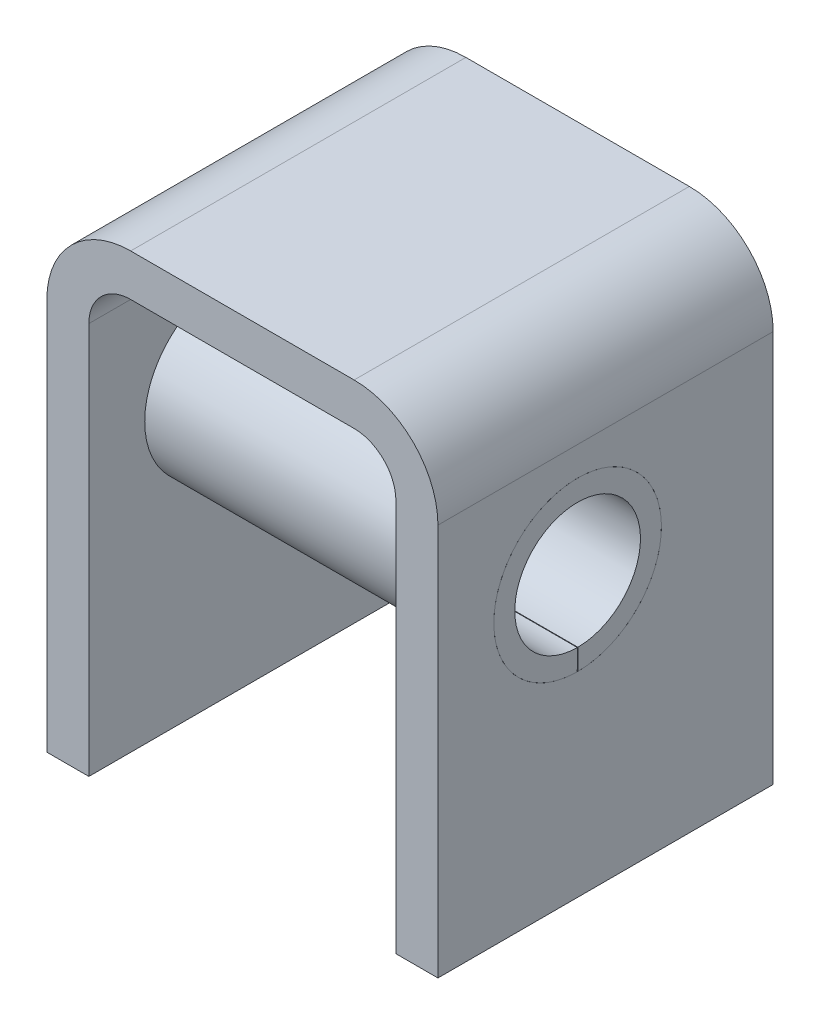
ISO-10303-21;
HEADER;
FILE_DESCRIPTION(('STEP AP214'),'2;1');
FILE_NAME('part.step','',(''),(''),'','','');
FILE_SCHEMA(('AUTOMOTIVE_DESIGN { 1 0 10303 214 1 1 1 1 }'));
ENDSEC;
DATA;
#1=APPLICATION_CONTEXT('core data for automotive mechanical design processes');
#2=APPLICATION_PROTOCOL_DEFINITION('international standard','automotive_design',2000,#1);
#3=PRODUCT_CONTEXT('',#1,'mechanical');
#4=PRODUCT('Part','Part','',(#3));
#5=PRODUCT_RELATED_PRODUCT_CATEGORY('part','',(#4));
#6=PRODUCT_DEFINITION_FORMATION('','',#4);
#7=PRODUCT_DEFINITION_CONTEXT('part definition',#1,'design');
#8=PRODUCT_DEFINITION('design','',#6,#7);
#9=PRODUCT_DEFINITION_SHAPE('','',#8);
#10=(LENGTH_UNIT() NAMED_UNIT(*) SI_UNIT(.MILLI.,.METRE.));
#11=(NAMED_UNIT(*) PLANE_ANGLE_UNIT() SI_UNIT($,.RADIAN.));
#12=(NAMED_UNIT(*) SI_UNIT($,.STERADIAN.) SOLID_ANGLE_UNIT());
#13=UNCERTAINTY_MEASURE_WITH_UNIT(LENGTH_MEASURE(1.E-05),#10,'distance_accuracy_value','');
#14=(GEOMETRIC_REPRESENTATION_CONTEXT(3) GLOBAL_UNCERTAINTY_ASSIGNED_CONTEXT((#13)) GLOBAL_UNIT_ASSIGNED_CONTEXT((#10,
#11,#12)) REPRESENTATION_CONTEXT('',''));
#15=CARTESIAN_POINT('',(0.,0.,0.));
#16=DIRECTION('',(0.,0.,1.));
#17=DIRECTION('',(1.,0.,0.));
#18=AXIS2_PLACEMENT_3D('',#15,#16,#17);
#19=CARTESIAN_POINT('',(22.225,-22.352,3.175));
#20=DIRECTION('',(-1.,0.,0.));
#21=DIRECTION('',(0.,0.,1.));
#22=AXIS2_PLACEMENT_3D('',#19,#20,#21);
#23=CYLINDRICAL_SURFACE('',#22,7.14375);
#24=CARTESIAN_POINT('',(-22.225,-22.352,3.175));
#25=DIRECTION('',(-1.,0.,0.));
#26=DIRECTION('',(0.,0.,-1.));
#27=AXIS2_PLACEMENT_3D('',#24,#25,#26);
#28=CIRCLE('',#27,7.14375);
#29=CARTESIAN_POINT('',(-22.225,-29.4956819966488,3.20617039070291));
#30=VERTEX_POINT('',#29);
#31=CARTESIAN_POINT('',(-22.225,-29.4956819966488,3.14382960929709));
#32=VERTEX_POINT('',#31);
#33=EDGE_CURVE('E107',#30,#32,#28,.T.);
#34=ORIENTED_EDGE('',*,*,#33,.T.);
#35=DIRECTION('',(-1.,0.,0.));
#36=VECTOR('',#35,1.);
#37=CARTESIAN_POINT('',(22.225,-29.4956819966488,3.14382960929709));
#38=LINE('',#37,#36);
#39=CARTESIAN_POINT('',(22.225,-29.4956819966488,3.14382960929709));
#40=VERTEX_POINT('',#39);
#41=EDGE_CURVE('E12',#40,#32,#38,.T.);
#42=ORIENTED_EDGE('',*,*,#41,.F.);
#43=CARTESIAN_POINT('',(22.225,-22.352,3.175));
#44=DIRECTION('',(-1.,0.,0.));
#45=DIRECTION('',(0.,0.,-1.));
#46=AXIS2_PLACEMENT_3D('',#43,#44,#45);
#47=CIRCLE('',#46,7.14375);
#48=CARTESIAN_POINT('',(22.225,-29.4956819966488,3.20617039070291));
#49=VERTEX_POINT('',#48);
#50=EDGE_CURVE('E95',#49,#40,#47,.T.);
#51=ORIENTED_EDGE('',*,*,#50,.F.);
#52=DIRECTION('',(-1.,0.,0.));
#53=VECTOR('',#52,1.);
#54=CARTESIAN_POINT('',(22.225,-29.4956819966488,3.20617039070291));
#55=LINE('',#54,#53);
#56=EDGE_CURVE('E103',#49,#30,#55,.T.);
#57=ORIENTED_EDGE('',*,*,#56,.T.);
#58=EDGE_LOOP('',(#34,#42,#51,#57));
#59=FACE_BOUND('',#58,.T.);
#60=ADVANCED_FACE('F44',(#59),#23,.F.);
#61=CARTESIAN_POINT('',(22.225,-29.4956819966488,3.14382960929709));
#62=DIRECTION('',(0.,0.00436330928474678,-0.999990480720734));
#63=DIRECTION('',(0.,0.999990480720734,0.00436330928474678));
#64=AXIS2_PLACEMENT_3D('',#61,#62,#63);
#65=PLANE('',#64);
#66=DIRECTION('',(0.,-0.999990480720735,-0.00436330928474678));
#67=VECTOR('',#66,1.);
#68=CARTESIAN_POINT('',(-22.225,-29.4956819966488,3.14382960929709));
#69=LINE('',#68,#67);
#70=CARTESIAN_POINT('',(-22.225,-31.876909328865,3.13343947906279));
#71=VERTEX_POINT('',#70);
#72=EDGE_CURVE('E99',#32,#71,#69,.T.);
#73=ORIENTED_EDGE('',*,*,#72,.T.);
#74=DIRECTION('',(-1.,0.,0.));
#75=VECTOR('',#74,1.);
#76=CARTESIAN_POINT('',(22.225,-31.876909328865,3.13343947906279));
#77=LINE('',#76,#75);
#78=CARTESIAN_POINT('',(22.225,-31.876909328865,3.13343947906279));
#79=VERTEX_POINT('',#78);
#80=EDGE_CURVE('E52',#79,#71,#77,.T.);
#81=ORIENTED_EDGE('',*,*,#80,.F.);
#82=DIRECTION('',(0.,-0.999990480720735,-0.00436330928474678));
#83=VECTOR('',#82,1.);
#84=CARTESIAN_POINT('',(22.225,-29.4956819966488,3.14382960929709));
#85=LINE('',#84,#83);
#86=EDGE_CURVE('E90',#40,#79,#85,.T.);
#87=ORIENTED_EDGE('',*,*,#86,.F.);
#88=ORIENTED_EDGE('',*,*,#41,.T.);
#89=EDGE_LOOP('',(#73,#81,#87,#88));
#90=FACE_BOUND('',#89,.T.);
#91=ADVANCED_FACE('F98',(#90),#65,.F.);
#92=CARTESIAN_POINT('',(22.225,-22.352,3.175));
#93=DIRECTION('',(-1.,0.,0.));
#94=DIRECTION('',(0.,0.,1.));
#95=AXIS2_PLACEMENT_3D('',#92,#93,#94);
#96=CYLINDRICAL_SURFACE('',#95,9.525);
#97=CARTESIAN_POINT('',(-22.225,-22.352,3.175));
#98=DIRECTION('',(1.,0.,0.));
#99=DIRECTION('',(0.,0.,-1.));
#100=AXIS2_PLACEMENT_3D('',#97,#98,#99);
#101=CIRCLE('',#100,9.525);
#102=CARTESIAN_POINT('',(-22.225,-31.876909328865,3.21656052093721));
#103=VERTEX_POINT('',#102);
#104=EDGE_CURVE('E77',#71,#103,#101,.T.);
#105=ORIENTED_EDGE('',*,*,#104,.T.);
#106=DIRECTION('',(-1.,0.,0.));
#107=VECTOR('',#106,1.);
#108=CARTESIAN_POINT('',(22.225,-31.876909328865,3.21656052093721));
#109=LINE('',#108,#107);
#110=CARTESIAN_POINT('',(22.225,-31.876909328865,3.21656052093721));
#111=VERTEX_POINT('',#110);
#112=EDGE_CURVE('E100',#111,#103,#109,.T.);
#113=ORIENTED_EDGE('',*,*,#112,.F.);
#114=CARTESIAN_POINT('',(22.225,-22.352,3.175));
#115=DIRECTION('',(1.,0.,0.));
#116=DIRECTION('',(0.,0.,-1.));
#117=AXIS2_PLACEMENT_3D('',#114,#115,#116);
#118=CIRCLE('',#117,9.525);
#119=EDGE_CURVE('E93',#79,#111,#118,.T.);
#120=ORIENTED_EDGE('',*,*,#119,.F.);
#121=ORIENTED_EDGE('',*,*,#80,.T.);
#122=EDGE_LOOP('',(#105,#113,#120,#121));
#123=FACE_BOUND('',#122,.T.);
#124=ADVANCED_FACE('F101',(#123),#96,.T.);
#125=CARTESIAN_POINT('',(22.225,-29.4956819966488,3.20617039070291));
#126=DIRECTION('',(0.,0.0043633092847466,0.999990480720734));
#127=DIRECTION('',(0.,-0.999990480720734,0.0043633092847466));
#128=AXIS2_PLACEMENT_3D('',#125,#126,#127);
#129=PLANE('',#128);
#130=DIRECTION('',(0.,0.999990480720735,-0.0043633092847466));
#131=VECTOR('',#130,1.);
#132=CARTESIAN_POINT('',(-22.225,-29.4956819966488,3.20617039070291));
#133=LINE('',#132,#131);
#134=EDGE_CURVE('E83',#103,#30,#133,.T.);
#135=ORIENTED_EDGE('',*,*,#134,.T.);
#136=ORIENTED_EDGE('',*,*,#56,.F.);
#137=DIRECTION('',(0.,0.999990480720735,-0.0043633092847466));
#138=VECTOR('',#137,1.);
#139=CARTESIAN_POINT('',(22.225,-29.4956819966488,3.20617039070291));
#140=LINE('',#139,#138);
#141=EDGE_CURVE('E60',#111,#49,#140,.T.);
#142=ORIENTED_EDGE('',*,*,#141,.F.);
#143=ORIENTED_EDGE('',*,*,#112,.T.);
#144=EDGE_LOOP('',(#135,#136,#142,#143));
#145=FACE_BOUND('',#144,.T.);
#146=ADVANCED_FACE('F114',(#145),#129,.F.);
#147=CARTESIAN_POINT('',(22.225,-22.352,3.175));
#148=DIRECTION('',(1.,0.,0.));
#149=DIRECTION('',(0.,0.,-1.));
#150=AXIS2_PLACEMENT_3D('',#147,#148,#149);
#151=PLANE('',#150);
#152=ORIENTED_EDGE('',*,*,#50,.T.);
#153=ORIENTED_EDGE('',*,*,#86,.T.);
#154=ORIENTED_EDGE('',*,*,#119,.T.);
#155=ORIENTED_EDGE('',*,*,#141,.T.);
#156=EDGE_LOOP('',(#152,#153,#154,#155));
#157=FACE_BOUND('',#156,.T.);
#158=ADVANCED_FACE('F91',(#157),#151,.T.);
#159=CARTESIAN_POINT('',(-22.225,-22.352,3.175));
#160=DIRECTION('',(1.,0.,0.));
#161=DIRECTION('',(0.,0.,-1.));
#162=AXIS2_PLACEMENT_3D('',#159,#160,#161);
#163=PLANE('',#162);
#164=ORIENTED_EDGE('',*,*,#33,.F.);
#165=ORIENTED_EDGE('',*,*,#134,.F.);
#166=ORIENTED_EDGE('',*,*,#104,.F.);
#167=ORIENTED_EDGE('',*,*,#72,.F.);
#168=EDGE_LOOP('',(#164,#165,#166,#167));
#169=FACE_BOUND('',#168,.T.);
#170=ADVANCED_FACE('F117',(#169),#163,.F.);
#171=CLOSED_SHELL('',(#60,#91,#124,#146,#158,#170));
#172=MANIFOLD_SOLID_BREP('B2',#171);
#173=CARTESIAN_POINT('',(17.4498,-54.102,19.05));
#174=DIRECTION('',(0.,1.,0.));
#175=DIRECTION('',(-1.,0.,0.));
#176=AXIS2_PLACEMENT_3D('',#173,#174,#175);
#177=PLANE('',#176);
#178=DIRECTION('',(1.,0.,0.));
#179=VECTOR('',#178,1.);
#180=CARTESIAN_POINT('',(17.4498,-54.102,-19.05));
#181=LINE('',#180,#179);
#182=CARTESIAN_POINT('',(17.4498,-54.102,-19.05));
#183=VERTEX_POINT('',#182);
#184=CARTESIAN_POINT('',(22.225,-54.102,-19.05));
#185=VERTEX_POINT('',#184);
#186=EDGE_CURVE('E288',#183,#185,#181,.T.);
#187=ORIENTED_EDGE('',*,*,#186,.T.);
#188=DIRECTION('',(0.,0.,-1.));
#189=VECTOR('',#188,1.);
#190=CARTESIAN_POINT('',(22.225,-54.102,19.05));
#191=LINE('',#190,#189);
#192=CARTESIAN_POINT('',(22.225,-54.102,19.05));
#193=VERTEX_POINT('',#192);
#194=EDGE_CURVE('E42',#193,#185,#191,.T.);
#195=ORIENTED_EDGE('',*,*,#194,.F.);
#196=DIRECTION('',(1.,0.,0.));
#197=VECTOR('',#196,1.);
#198=CARTESIAN_POINT('',(17.4498,-54.102,19.05));
#199=LINE('',#198,#197);
#200=CARTESIAN_POINT('',(17.4498,-54.102,19.05));
#201=VERTEX_POINT('',#200);
#202=EDGE_CURVE('E311',#201,#193,#199,.T.);
#203=ORIENTED_EDGE('',*,*,#202,.F.);
#204=DIRECTION('',(0.,0.,-1.));
#205=VECTOR('',#204,1.);
#206=CARTESIAN_POINT('',(17.4498,-54.102,19.05));
#207=LINE('',#206,#205);
#208=EDGE_CURVE('E284',#201,#183,#207,.T.);
#209=ORIENTED_EDGE('',*,*,#208,.T.);
#210=EDGE_LOOP('',(#187,#195,#203,#209));
#211=FACE_BOUND('',#210,.T.);
#212=ADVANCED_FACE('F167',(#211),#177,.F.);
#213=CARTESIAN_POINT('',(22.225,-9.525,19.05));
#214=DIRECTION('',(-1.,0.,0.));
#215=DIRECTION('',(0.,-1.,0.));
#216=AXIS2_PLACEMENT_3D('',#213,#214,#215);
#217=PLANE('',#216);
#218=CARTESIAN_POINT('',(22.225,-22.352,3.175));
#219=DIRECTION('',(1.,0.,0.));
#220=DIRECTION('',(0.,1.,0.));
#221=AXIS2_PLACEMENT_3D('',#218,#219,#220);
#222=CIRCLE('',#221,9.525);
#223=CARTESIAN_POINT('',(22.225,-12.827,3.175));
#224=VERTEX_POINT('',#223);
#225=EDGE_CURVE('E499',#224,#224,#222,.T.);
#226=ORIENTED_EDGE('',*,*,#225,.F.);
#227=EDGE_LOOP('',(#226));
#228=FACE_BOUND('',#227,.T.);
#229=DIRECTION('',(0.,1.,0.));
#230=VECTOR('',#229,1.);
#231=CARTESIAN_POINT('',(22.225,-9.525,-19.05));
#232=LINE('',#231,#230);
#233=CARTESIAN_POINT('',(22.225,-9.525,-19.05));
#234=VERTEX_POINT('',#233);
#235=EDGE_CURVE('E291',#185,#234,#232,.T.);
#236=ORIENTED_EDGE('',*,*,#235,.T.);
#237=DIRECTION('',(0.,0.,-1.));
#238=VECTOR('',#237,1.);
#239=CARTESIAN_POINT('',(22.225,-9.525,19.05));
#240=LINE('',#239,#238);
#241=CARTESIAN_POINT('',(22.225,-9.525,19.05));
#242=VERTEX_POINT('',#241);
#243=EDGE_CURVE('E176',#242,#234,#240,.T.);
#244=ORIENTED_EDGE('',*,*,#243,.F.);
#245=DIRECTION('',(0.,1.,0.));
#246=VECTOR('',#245,1.);
#247=CARTESIAN_POINT('',(22.225,-9.525,19.05));
#248=LINE('',#247,#246);
#249=EDGE_CURVE('E239',#193,#242,#248,.T.);
#250=ORIENTED_EDGE('',*,*,#249,.F.);
#251=ORIENTED_EDGE('',*,*,#194,.T.);
#252=EDGE_LOOP('',(#236,#244,#250,#251));
#253=FACE_BOUND('',#252,.T.);
#254=ADVANCED_FACE('F392',(#228,#253),#217,.F.);
#255=CARTESIAN_POINT('',(12.7,-9.525,19.05));
#256=DIRECTION('',(0.,0.,-1.));
#257=DIRECTION('',(-1.,0.,0.));
#258=AXIS2_PLACEMENT_3D('',#255,#256,#257);
#259=CYLINDRICAL_SURFACE('',#258,9.525);
#260=CARTESIAN_POINT('',(12.7,-9.525,-19.05));
#261=DIRECTION('',(0.,0.,1.));
#262=DIRECTION('',(-1.,0.,0.));
#263=AXIS2_PLACEMENT_3D('',#260,#261,#262);
#264=CIRCLE('',#263,9.525);
#265=CARTESIAN_POINT('',(12.7,0.,-19.05));
#266=VERTEX_POINT('',#265);
#267=EDGE_CURVE('E294',#234,#266,#264,.T.);
#268=ORIENTED_EDGE('',*,*,#267,.T.);
#269=DIRECTION('',(0.,0.,-1.));
#270=VECTOR('',#269,1.);
#271=CARTESIAN_POINT('',(12.7,0.,19.05));
#272=LINE('',#271,#270);
#273=CARTESIAN_POINT('',(12.7,0.,19.05));
#274=VERTEX_POINT('',#273);
#275=EDGE_CURVE('E330',#274,#266,#272,.T.);
#276=ORIENTED_EDGE('',*,*,#275,.F.);
#277=CARTESIAN_POINT('',(12.7,-9.525,19.05));
#278=DIRECTION('',(0.,0.,1.));
#279=DIRECTION('',(-1.,0.,0.));
#280=AXIS2_PLACEMENT_3D('',#277,#278,#279);
#281=CIRCLE('',#280,9.525);
#282=EDGE_CURVE('E339',#242,#274,#281,.T.);
#283=ORIENTED_EDGE('',*,*,#282,.F.);
#284=ORIENTED_EDGE('',*,*,#243,.T.);
#285=EDGE_LOOP('',(#268,#276,#283,#284));
#286=FACE_BOUND('',#285,.T.);
#287=ADVANCED_FACE('F337',(#286),#259,.T.);
#288=CARTESIAN_POINT('',(-12.7,0.,19.05));
#289=DIRECTION('',(0.,-1.,0.));
#290=DIRECTION('',(0.,0.,-1.));
#291=AXIS2_PLACEMENT_3D('',#288,#289,#290);
#292=PLANE('',#291);
#293=DIRECTION('',(-1.,0.,0.));
#294=VECTOR('',#293,1.);
#295=CARTESIAN_POINT('',(-12.7,0.,-19.05));
#296=LINE('',#295,#294);
#297=CARTESIAN_POINT('',(-12.7,0.,-19.05));
#298=VERTEX_POINT('',#297);
#299=EDGE_CURVE('E296',#266,#298,#296,.T.);
#300=ORIENTED_EDGE('',*,*,#299,.T.);
#301=DIRECTION('',(0.,0.,-1.));
#302=VECTOR('',#301,1.);
#303=CARTESIAN_POINT('',(-12.7,0.,19.05));
#304=LINE('',#303,#302);
#305=CARTESIAN_POINT('',(-12.7,0.,19.05));
#306=VERTEX_POINT('',#305);
#307=EDGE_CURVE('E327',#306,#298,#304,.T.);
#308=ORIENTED_EDGE('',*,*,#307,.F.);
#309=DIRECTION('',(-1.,0.,0.));
#310=VECTOR('',#309,1.);
#311=CARTESIAN_POINT('',(-12.7,0.,19.05));
#312=LINE('',#311,#310);
#313=EDGE_CURVE('E357',#274,#306,#312,.T.);
#314=ORIENTED_EDGE('',*,*,#313,.F.);
#315=ORIENTED_EDGE('',*,*,#275,.T.);
#316=EDGE_LOOP('',(#300,#308,#314,#315));
#317=FACE_BOUND('',#316,.T.);
#318=ADVANCED_FACE('F348',(#317),#292,.F.);
#319=CARTESIAN_POINT('',(-12.7,-9.525,19.05));
#320=DIRECTION('',(0.,0.,-1.));
#321=DIRECTION('',(-1.,0.,0.));
#322=AXIS2_PLACEMENT_3D('',#319,#320,#321);
#323=CYLINDRICAL_SURFACE('',#322,9.525);
#324=CARTESIAN_POINT('',(-12.7,-9.525,-19.05));
#325=DIRECTION('',(0.,0.,1.));
#326=DIRECTION('',(1.,0.,0.));
#327=AXIS2_PLACEMENT_3D('',#324,#325,#326);
#328=CIRCLE('',#327,9.525);
#329=CARTESIAN_POINT('',(-22.225,-9.525,-19.05));
#330=VERTEX_POINT('',#329);
#331=EDGE_CURVE('E298',#298,#330,#328,.T.);
#332=ORIENTED_EDGE('',*,*,#331,.T.);
#333=DIRECTION('',(0.,0.,-1.));
#334=VECTOR('',#333,1.);
#335=CARTESIAN_POINT('',(-22.225,-9.525,19.05));
#336=LINE('',#335,#334);
#337=CARTESIAN_POINT('',(-22.225,-9.525,19.05));
#338=VERTEX_POINT('',#337);
#339=EDGE_CURVE('E324',#338,#330,#336,.T.);
#340=ORIENTED_EDGE('',*,*,#339,.F.);
#341=CARTESIAN_POINT('',(-12.7,-9.525,19.05));
#342=DIRECTION('',(0.,0.,1.));
#343=DIRECTION('',(1.,0.,0.));
#344=AXIS2_PLACEMENT_3D('',#341,#342,#343);
#345=CIRCLE('',#344,9.525);
#346=EDGE_CURVE('E354',#306,#338,#345,.T.);
#347=ORIENTED_EDGE('',*,*,#346,.F.);
#348=ORIENTED_EDGE('',*,*,#307,.T.);
#349=EDGE_LOOP('',(#332,#340,#347,#348));
#350=FACE_BOUND('',#349,.T.);
#351=ADVANCED_FACE('F352',(#350),#323,.T.);
#352=CARTESIAN_POINT('',(-22.225,-9.525,19.05));
#353=DIRECTION('',(1.,0.,0.));
#354=DIRECTION('',(0.,0.,-1.));
#355=AXIS2_PLACEMENT_3D('',#352,#353,#354);
#356=PLANE('',#355);
#357=CARTESIAN_POINT('',(-22.225,-22.352,3.175));
#358=DIRECTION('',(1.,0.,0.));
#359=DIRECTION('',(0.,1.,0.));
#360=AXIS2_PLACEMENT_3D('',#357,#358,#359);
#361=CIRCLE('',#360,9.525);
#362=CARTESIAN_POINT('',(-22.225,-12.827,3.175));
#363=VERTEX_POINT('',#362);
#364=EDGE_CURVE('E493',#363,#363,#361,.T.);
#365=ORIENTED_EDGE('',*,*,#364,.T.);
#366=EDGE_LOOP('',(#365));
#367=FACE_BOUND('',#366,.T.);
#368=DIRECTION('',(0.,-1.,0.));
#369=VECTOR('',#368,1.);
#370=CARTESIAN_POINT('',(-22.225,-9.525,-19.05));
#371=LINE('',#370,#369);
#372=CARTESIAN_POINT('',(-22.225,-54.102,-19.05));
#373=VERTEX_POINT('',#372);
#374=EDGE_CURVE('E300',#330,#373,#371,.T.);
#375=ORIENTED_EDGE('',*,*,#374,.T.);
#376=DIRECTION('',(0.,0.,-1.));
#377=VECTOR('',#376,1.);
#378=CARTESIAN_POINT('',(-22.225,-54.102,19.05));
#379=LINE('',#378,#377);
#380=CARTESIAN_POINT('',(-22.225,-54.102,19.05));
#381=VERTEX_POINT('',#380);
#382=EDGE_CURVE('E321',#381,#373,#379,.T.);
#383=ORIENTED_EDGE('',*,*,#382,.F.);
#384=DIRECTION('',(0.,-1.,0.));
#385=VECTOR('',#384,1.);
#386=CARTESIAN_POINT('',(-22.225,-9.525,19.05));
#387=LINE('',#386,#385);
#388=EDGE_CURVE('E356',#338,#381,#387,.T.);
#389=ORIENTED_EDGE('',*,*,#388,.F.);
#390=ORIENTED_EDGE('',*,*,#339,.T.);
#391=EDGE_LOOP('',(#375,#383,#389,#390));
#392=FACE_BOUND('',#391,.T.);
#393=ADVANCED_FACE('F407',(#367,#392),#356,.F.);
#394=CARTESIAN_POINT('',(-22.225,-54.102,19.05));
#395=DIRECTION('',(0.,1.,0.));
#396=DIRECTION('',(0.,0.,1.));
#397=AXIS2_PLACEMENT_3D('',#394,#395,#396);
#398=PLANE('',#397);
#399=DIRECTION('',(1.,0.,0.));
#400=VECTOR('',#399,1.);
#401=CARTESIAN_POINT('',(-22.225,-54.102,-19.05));
#402=LINE('',#401,#400);
#403=CARTESIAN_POINT('',(-17.4498,-54.102,-19.05));
#404=VERTEX_POINT('',#403);
#405=EDGE_CURVE('E302',#373,#404,#402,.T.);
#406=ORIENTED_EDGE('',*,*,#405,.T.);
#407=DIRECTION('',(0.,0.,-1.));
#408=VECTOR('',#407,1.);
#409=CARTESIAN_POINT('',(-17.4498,-54.102,19.05));
#410=LINE('',#409,#408);
#411=CARTESIAN_POINT('',(-17.4498,-54.102,19.05));
#412=VERTEX_POINT('',#411);
#413=EDGE_CURVE('E318',#412,#404,#410,.T.);
#414=ORIENTED_EDGE('',*,*,#413,.F.);
#415=DIRECTION('',(1.,0.,0.));
#416=VECTOR('',#415,1.);
#417=CARTESIAN_POINT('',(-22.225,-54.102,19.05));
#418=LINE('',#417,#416);
#419=EDGE_CURVE('E359',#381,#412,#418,.T.);
#420=ORIENTED_EDGE('',*,*,#419,.F.);
#421=ORIENTED_EDGE('',*,*,#382,.T.);
#422=EDGE_LOOP('',(#406,#414,#420,#421));
#423=FACE_BOUND('',#422,.T.);
#424=ADVANCED_FACE('F410',(#423),#398,.F.);
#425=CARTESIAN_POINT('',(-17.4498,-9.525,19.05));
#426=DIRECTION('',(-1.,0.,0.));
#427=DIRECTION('',(0.,-1.,0.));
#428=AXIS2_PLACEMENT_3D('',#425,#426,#427);
#429=PLANE('',#428);
#430=CARTESIAN_POINT('',(-17.4498,-22.352,3.175));
#431=DIRECTION('',(-1.,0.,0.));
#432=DIRECTION('',(0.,-1.,0.));
#433=AXIS2_PLACEMENT_3D('',#430,#431,#432);
#434=CIRCLE('',#433,9.525);
#435=CARTESIAN_POINT('',(-17.4498,-31.877,3.175));
#436=VERTEX_POINT('',#435);
#437=EDGE_CURVE('E292',#436,#436,#434,.T.);
#438=ORIENTED_EDGE('',*,*,#437,.T.);
#439=EDGE_LOOP('',(#438));
#440=FACE_BOUND('',#439,.T.);
#441=DIRECTION('',(0.,1.,0.));
#442=VECTOR('',#441,1.);
#443=CARTESIAN_POINT('',(-17.4498,-9.525,-19.05));
#444=LINE('',#443,#442);
#445=CARTESIAN_POINT('',(-17.4498,-9.525,-19.05));
#446=VERTEX_POINT('',#445);
#447=EDGE_CURVE('E304',#404,#446,#444,.T.);
#448=ORIENTED_EDGE('',*,*,#447,.T.);
#449=DIRECTION('',(0.,0.,-1.));
#450=VECTOR('',#449,1.);
#451=CARTESIAN_POINT('',(-17.4498,-9.525,19.05));
#452=LINE('',#451,#450);
#453=CARTESIAN_POINT('',(-17.4498,-9.525,19.05));
#454=VERTEX_POINT('',#453);
#455=EDGE_CURVE('E315',#454,#446,#452,.T.);
#456=ORIENTED_EDGE('',*,*,#455,.F.);
#457=DIRECTION('',(0.,1.,0.));
#458=VECTOR('',#457,1.);
#459=CARTESIAN_POINT('',(-17.4498,-9.525,19.05));
#460=LINE('',#459,#458);
#461=EDGE_CURVE('E365',#412,#454,#460,.T.);
#462=ORIENTED_EDGE('',*,*,#461,.F.);
#463=ORIENTED_EDGE('',*,*,#413,.T.);
#464=EDGE_LOOP('',(#448,#456,#462,#463));
#465=FACE_BOUND('',#464,.T.);
#466=ADVANCED_FACE('F371',(#440,#465),#429,.F.);
#467=CARTESIAN_POINT('',(-12.7,-9.525,19.05));
#468=DIRECTION('',(0.,0.,-1.));
#469=DIRECTION('',(-1.,0.,0.));
#470=AXIS2_PLACEMENT_3D('',#467,#468,#469);
#471=CYLINDRICAL_SURFACE('',#470,4.7498);
#472=CARTESIAN_POINT('',(-12.7,-9.525,-19.05));
#473=DIRECTION('',(0.,0.,-1.));
#474=DIRECTION('',(1.,0.,0.));
#475=AXIS2_PLACEMENT_3D('',#472,#473,#474);
#476=CIRCLE('',#475,4.7498);
#477=CARTESIAN_POINT('',(-12.7,-4.7752,-19.05));
#478=VERTEX_POINT('',#477);
#479=EDGE_CURVE('E306',#446,#478,#476,.T.);
#480=ORIENTED_EDGE('',*,*,#479,.T.);
#481=DIRECTION('',(0.,0.,-1.));
#482=VECTOR('',#481,1.);
#483=CARTESIAN_POINT('',(-12.7,-4.7752,19.05));
#484=LINE('',#483,#482);
#485=CARTESIAN_POINT('',(-12.7,-4.7752,19.05));
#486=VERTEX_POINT('',#485);
#487=EDGE_CURVE('E279',#486,#478,#484,.T.);
#488=ORIENTED_EDGE('',*,*,#487,.F.);
#489=CARTESIAN_POINT('',(-12.7,-9.525,19.05));
#490=DIRECTION('',(0.,0.,-1.));
#491=DIRECTION('',(1.,0.,0.));
#492=AXIS2_PLACEMENT_3D('',#489,#490,#491);
#493=CIRCLE('',#492,4.7498);
#494=EDGE_CURVE('E270',#454,#486,#493,.T.);
#495=ORIENTED_EDGE('',*,*,#494,.F.);
#496=ORIENTED_EDGE('',*,*,#455,.T.);
#497=EDGE_LOOP('',(#480,#488,#495,#496));
#498=FACE_BOUND('',#497,.T.);
#499=ADVANCED_FACE('F375',(#498),#471,.F.);
#500=CARTESIAN_POINT('',(-12.7,-4.7752,19.05));
#501=DIRECTION('',(0.,1.,0.));
#502=DIRECTION('',(0.,0.,1.));
#503=AXIS2_PLACEMENT_3D('',#500,#501,#502);
#504=PLANE('',#503);
#505=DIRECTION('',(1.,0.,0.));
#506=VECTOR('',#505,1.);
#507=CARTESIAN_POINT('',(-12.7,-4.7752,-19.05));
#508=LINE('',#507,#506);
#509=CARTESIAN_POINT('',(12.7,-4.7752,-19.05));
#510=VERTEX_POINT('',#509);
#511=EDGE_CURVE('E278',#478,#510,#508,.T.);
#512=ORIENTED_EDGE('',*,*,#511,.T.);
#513=DIRECTION('',(0.,0.,-1.));
#514=VECTOR('',#513,1.);
#515=CARTESIAN_POINT('',(12.7,-4.7752,19.05));
#516=LINE('',#515,#514);
#517=CARTESIAN_POINT('',(12.7,-4.7752,19.05));
#518=VERTEX_POINT('',#517);
#519=EDGE_CURVE('E275',#518,#510,#516,.T.);
#520=ORIENTED_EDGE('',*,*,#519,.F.);
#521=DIRECTION('',(1.,0.,0.));
#522=VECTOR('',#521,1.);
#523=CARTESIAN_POINT('',(-12.7,-4.7752,19.05));
#524=LINE('',#523,#522);
#525=EDGE_CURVE('E264',#486,#518,#524,.T.);
#526=ORIENTED_EDGE('',*,*,#525,.F.);
#527=ORIENTED_EDGE('',*,*,#487,.T.);
#528=EDGE_LOOP('',(#512,#520,#526,#527));
#529=FACE_BOUND('',#528,.T.);
#530=ADVANCED_FACE('F276',(#529),#504,.F.);
#531=CARTESIAN_POINT('',(12.7,-9.525,19.05));
#532=DIRECTION('',(0.,0.,-1.));
#533=DIRECTION('',(-1.,0.,0.));
#534=AXIS2_PLACEMENT_3D('',#531,#532,#533);
#535=CYLINDRICAL_SURFACE('',#534,4.7498);
#536=CARTESIAN_POINT('',(12.7,-9.525,-19.05));
#537=DIRECTION('',(0.,0.,-1.));
#538=DIRECTION('',(-1.,0.,0.));
#539=AXIS2_PLACEMENT_3D('',#536,#537,#538);
#540=CIRCLE('',#539,4.7498);
#541=CARTESIAN_POINT('',(17.4498,-9.525,-19.05));
#542=VERTEX_POINT('',#541);
#543=EDGE_CURVE('E225',#510,#542,#540,.T.);
#544=ORIENTED_EDGE('',*,*,#543,.T.);
#545=DIRECTION('',(0.,0.,-1.));
#546=VECTOR('',#545,1.);
#547=CARTESIAN_POINT('',(17.4498,-9.525,19.05));
#548=LINE('',#547,#546);
#549=CARTESIAN_POINT('',(17.4498,-9.525,19.05));
#550=VERTEX_POINT('',#549);
#551=EDGE_CURVE('E280',#550,#542,#548,.T.);
#552=ORIENTED_EDGE('',*,*,#551,.F.);
#553=CARTESIAN_POINT('',(12.7,-9.525,19.05));
#554=DIRECTION('',(0.,0.,-1.));
#555=DIRECTION('',(-1.,0.,0.));
#556=AXIS2_PLACEMENT_3D('',#553,#554,#555);
#557=CIRCLE('',#556,4.7498);
#558=EDGE_CURVE('E268',#518,#550,#557,.T.);
#559=ORIENTED_EDGE('',*,*,#558,.F.);
#560=ORIENTED_EDGE('',*,*,#519,.T.);
#561=EDGE_LOOP('',(#544,#552,#559,#560));
#562=FACE_BOUND('',#561,.T.);
#563=ADVANCED_FACE('F282',(#562),#535,.F.);
#564=CARTESIAN_POINT('',(17.4498,-9.525,19.05));
#565=DIRECTION('',(1.,0.,0.));
#566=DIRECTION('',(0.,1.,0.));
#567=AXIS2_PLACEMENT_3D('',#564,#565,#566);
#568=PLANE('',#567);
#569=CARTESIAN_POINT('',(17.4498,-22.352,3.175));
#570=DIRECTION('',(1.,0.,0.));
#571=DIRECTION('',(0.,1.,0.));
#572=AXIS2_PLACEMENT_3D('',#569,#570,#571);
#573=CIRCLE('',#572,9.525);
#574=CARTESIAN_POINT('',(17.4498,-12.827,3.175));
#575=VERTEX_POINT('',#574);
#576=EDGE_CURVE('E170',#575,#575,#573,.T.);
#577=ORIENTED_EDGE('',*,*,#576,.T.);
#578=EDGE_LOOP('',(#577));
#579=FACE_BOUND('',#578,.T.);
#580=DIRECTION('',(0.,-1.,0.));
#581=VECTOR('',#580,1.);
#582=CARTESIAN_POINT('',(17.4498,-9.525,-19.05));
#583=LINE('',#582,#581);
#584=EDGE_CURVE('E231',#542,#183,#583,.T.);
#585=ORIENTED_EDGE('',*,*,#584,.T.);
#586=ORIENTED_EDGE('',*,*,#208,.F.);
#587=DIRECTION('',(0.,-1.,0.));
#588=VECTOR('',#587,1.);
#589=CARTESIAN_POINT('',(17.4498,-9.525,19.05));
#590=LINE('',#589,#588);
#591=EDGE_CURVE('E184',#550,#201,#590,.T.);
#592=ORIENTED_EDGE('',*,*,#591,.F.);
#593=ORIENTED_EDGE('',*,*,#551,.T.);
#594=EDGE_LOOP('',(#585,#586,#592,#593));
#595=FACE_BOUND('',#594,.T.);
#596=ADVANCED_FACE('F379',(#579,#595),#568,.F.);
#597=CARTESIAN_POINT('',(12.7,-9.525,19.05));
#598=DIRECTION('',(0.,0.,-1.));
#599=DIRECTION('',(-1.,0.,0.));
#600=AXIS2_PLACEMENT_3D('',#597,#598,#599);
#601=PLANE('',#600);
#602=ORIENTED_EDGE('',*,*,#202,.T.);
#603=ORIENTED_EDGE('',*,*,#249,.T.);
#604=ORIENTED_EDGE('',*,*,#282,.T.);
#605=ORIENTED_EDGE('',*,*,#313,.T.);
#606=ORIENTED_EDGE('',*,*,#346,.T.);
#607=ORIENTED_EDGE('',*,*,#388,.T.);
#608=ORIENTED_EDGE('',*,*,#419,.T.);
#609=ORIENTED_EDGE('',*,*,#461,.T.);
#610=ORIENTED_EDGE('',*,*,#494,.T.);
#611=ORIENTED_EDGE('',*,*,#525,.T.);
#612=ORIENTED_EDGE('',*,*,#558,.T.);
#613=ORIENTED_EDGE('',*,*,#591,.T.);
#614=EDGE_LOOP('',(#602,#603,#604,#605,#606,#607,#608,#609,#610,#611,#612,#613));
#615=FACE_BOUND('',#614,.T.);
#616=ADVANCED_FACE('F266',(#615),#601,.F.);
#617=CARTESIAN_POINT('',(12.7,-9.525,-19.05));
#618=DIRECTION('',(0.,0.,-1.));
#619=DIRECTION('',(-1.,0.,0.));
#620=AXIS2_PLACEMENT_3D('',#617,#618,#619);
#621=PLANE('',#620);
#622=ORIENTED_EDGE('',*,*,#186,.F.);
#623=ORIENTED_EDGE('',*,*,#584,.F.);
#624=ORIENTED_EDGE('',*,*,#543,.F.);
#625=ORIENTED_EDGE('',*,*,#511,.F.);
#626=ORIENTED_EDGE('',*,*,#479,.F.);
#627=ORIENTED_EDGE('',*,*,#447,.F.);
#628=ORIENTED_EDGE('',*,*,#405,.F.);
#629=ORIENTED_EDGE('',*,*,#374,.F.);
#630=ORIENTED_EDGE('',*,*,#331,.F.);
#631=ORIENTED_EDGE('',*,*,#299,.F.);
#632=ORIENTED_EDGE('',*,*,#267,.F.);
#633=ORIENTED_EDGE('',*,*,#235,.F.);
#634=EDGE_LOOP('',(#622,#623,#624,#625,#626,#627,#628,#629,#630,#631,#632,#633));
#635=FACE_BOUND('',#634,.T.);
#636=ADVANCED_FACE('F343',(#635),#621,.T.);
#637=CARTESIAN_POINT('',(-22.225,-22.352,3.175));
#638=DIRECTION('',(1.,0.,0.));
#639=DIRECTION('',(0.,1.,0.));
#640=AXIS2_PLACEMENT_3D('',#637,#638,#639);
#641=CYLINDRICAL_SURFACE('',#640,9.525);
#642=ORIENTED_EDGE('',*,*,#225,.T.);
#643=EDGE_LOOP('',(#642));
#644=FACE_BOUND('',#643,.T.);
#645=ORIENTED_EDGE('',*,*,#576,.F.);
#646=EDGE_LOOP('',(#645));
#647=FACE_BOUND('',#646,.T.);
#648=ADVANCED_FACE('F444',(#644,#647),#641,.F.);
#649=ORIENTED_EDGE('',*,*,#364,.F.);
#650=EDGE_LOOP('',(#649));
#651=FACE_BOUND('',#650,.T.);
#652=ORIENTED_EDGE('',*,*,#437,.F.);
#653=EDGE_LOOP('',(#652));
#654=FACE_BOUND('',#653,.T.);
#655=ADVANCED_FACE('F477',(#651,#654),#641,.F.);
#656=CLOSED_SHELL('',(#212,#254,#287,#318,#351,#393,#424,#466,#499,#530,#563,#596,#616,#636,
#648,#655));
#657=MANIFOLD_SOLID_BREP('B6',#656);
#658=ADVANCED_BREP_SHAPE_REPRESENTATION('',(#18,#172,#657),#14);
#659=SHAPE_DEFINITION_REPRESENTATION(#9,#658);
ENDSEC;
END-ISO-10303-21;
